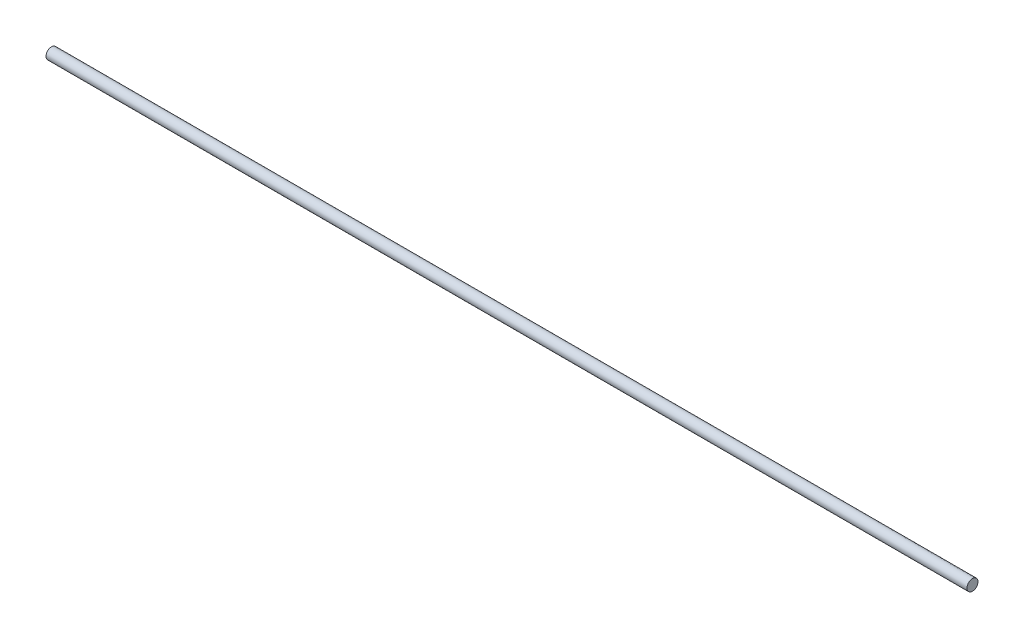
ISO-10303-21;
HEADER;
FILE_DESCRIPTION(('STEP AP214'),'2;1');
FILE_NAME('part.step','',(''),(''),'','','');
FILE_SCHEMA(('AUTOMOTIVE_DESIGN { 1 0 10303 214 1 1 1 1 }'));
ENDSEC;
DATA;
#1=APPLICATION_CONTEXT('core data for automotive mechanical design processes');
#2=APPLICATION_PROTOCOL_DEFINITION('international standard','automotive_design',2000,#1);
#3=PRODUCT_CONTEXT('',#1,'mechanical');
#4=PRODUCT('Part','Part','',(#3));
#5=PRODUCT_RELATED_PRODUCT_CATEGORY('part','',(#4));
#6=PRODUCT_DEFINITION_FORMATION('','',#4);
#7=PRODUCT_DEFINITION_CONTEXT('part definition',#1,'design');
#8=PRODUCT_DEFINITION('design','',#6,#7);
#9=PRODUCT_DEFINITION_SHAPE('','',#8);
#10=(LENGTH_UNIT() NAMED_UNIT(*) SI_UNIT(.MILLI.,.METRE.));
#11=(NAMED_UNIT(*) PLANE_ANGLE_UNIT() SI_UNIT($,.RADIAN.));
#12=(NAMED_UNIT(*) SI_UNIT($,.STERADIAN.) SOLID_ANGLE_UNIT());
#13=UNCERTAINTY_MEASURE_WITH_UNIT(LENGTH_MEASURE(1.E-05),#10,'distance_accuracy_value','');
#14=(GEOMETRIC_REPRESENTATION_CONTEXT(3) GLOBAL_UNCERTAINTY_ASSIGNED_CONTEXT((#13)) GLOBAL_UNIT_ASSIGNED_CONTEXT((#10,
#11,#12)) REPRESENTATION_CONTEXT('',''));
#15=CARTESIAN_POINT('',(0.,0.,0.));
#16=DIRECTION('',(0.,0.,1.));
#17=DIRECTION('',(1.,0.,0.));
#18=AXIS2_PLACEMENT_3D('',#15,#16,#17);
#19=CARTESIAN_POINT('',(250.,0.,0.));
#20=DIRECTION('',(-1.,0.,0.));
#21=DIRECTION('',(0.,0.,1.));
#22=AXIS2_PLACEMENT_3D('',#19,#20,#21);
#23=CYLINDRICAL_SURFACE('',#22,1.5);
#24=CARTESIAN_POINT('',(250.,0.,0.));
#25=DIRECTION('',(1.,0.,0.));
#26=DIRECTION('',(0.,0.,-1.));
#27=AXIS2_PLACEMENT_3D('',#24,#25,#26);
#28=CIRCLE('',#27,1.5);
#29=CARTESIAN_POINT('',(250.,0.,-1.5));
#30=VERTEX_POINT('',#29);
#31=EDGE_CURVE('E10',#30,#30,#28,.T.);
#32=ORIENTED_EDGE('',*,*,#31,.F.);
#33=EDGE_LOOP('',(#32));
#34=FACE_BOUND('',#33,.T.);
#35=CARTESIAN_POINT('',(0.,0.,0.));
#36=DIRECTION('',(1.,0.,0.));
#37=DIRECTION('',(0.,0.,-1.));
#38=AXIS2_PLACEMENT_3D('',#35,#36,#37);
#39=CIRCLE('',#38,1.5);
#40=CARTESIAN_POINT('',(0.,0.,-1.5));
#41=VERTEX_POINT('',#40);
#42=EDGE_CURVE('E36',#41,#41,#39,.T.);
#43=ORIENTED_EDGE('',*,*,#42,.T.);
#44=EDGE_LOOP('',(#43));
#45=FACE_BOUND('',#44,.T.);
#46=ADVANCED_FACE('F33',(#34,#45),#23,.T.);
#47=CARTESIAN_POINT('',(250.,0.,0.));
#48=DIRECTION('',(1.,0.,0.));
#49=DIRECTION('',(0.,0.,-1.));
#50=AXIS2_PLACEMENT_3D('',#47,#48,#49);
#51=PLANE('',#50);
#52=ORIENTED_EDGE('',*,*,#31,.T.);
#53=EDGE_LOOP('',(#52));
#54=FACE_BOUND('',#53,.T.);
#55=ADVANCED_FACE('F48',(#54),#51,.T.);
#56=CARTESIAN_POINT('',(0.,0.,0.));
#57=DIRECTION('',(1.,0.,0.));
#58=DIRECTION('',(0.,0.,-1.));
#59=AXIS2_PLACEMENT_3D('',#56,#57,#58);
#60=PLANE('',#59);
#61=ORIENTED_EDGE('',*,*,#42,.F.);
#62=EDGE_LOOP('',(#61));
#63=FACE_BOUND('',#62,.T.);
#64=ADVANCED_FACE('F46',(#63),#60,.F.);
#65=CLOSED_SHELL('',(#46,#55,#64));
#66=MANIFOLD_SOLID_BREP('B2',#65);
#67=ADVANCED_BREP_SHAPE_REPRESENTATION('',(#18,#66),#14);
#68=SHAPE_DEFINITION_REPRESENTATION(#9,#67);
ENDSEC;
END-ISO-10303-21;
